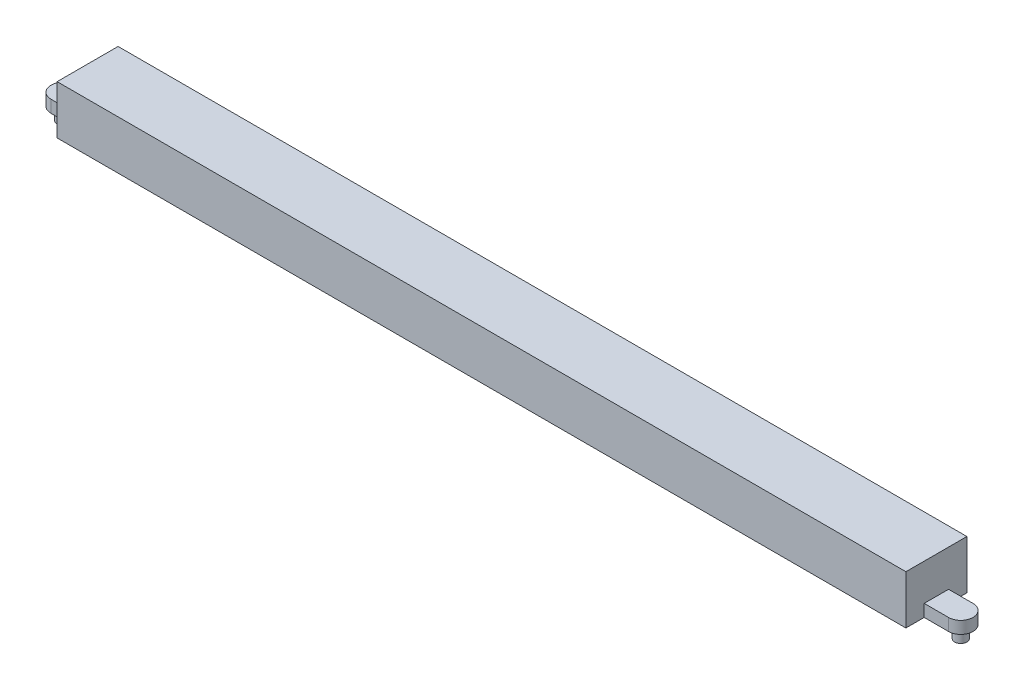
ISO-10303-21;
HEADER;
FILE_DESCRIPTION(('STEP AP214'),'2;1');
FILE_NAME('part.step','',(''),(''),'','','');
FILE_SCHEMA(('AUTOMOTIVE_DESIGN { 1 0 10303 214 1 1 1 1 }'));
ENDSEC;
DATA;
#1=APPLICATION_CONTEXT('core data for automotive mechanical design processes');
#2=APPLICATION_PROTOCOL_DEFINITION('international standard','automotive_design',2000,#1);
#3=PRODUCT_CONTEXT('',#1,'mechanical');
#4=PRODUCT('Part','Part','',(#3));
#5=PRODUCT_RELATED_PRODUCT_CATEGORY('part','',(#4));
#6=PRODUCT_DEFINITION_FORMATION('','',#4);
#7=PRODUCT_DEFINITION_CONTEXT('part definition',#1,'design');
#8=PRODUCT_DEFINITION('design','',#6,#7);
#9=PRODUCT_DEFINITION_SHAPE('','',#8);
#10=(LENGTH_UNIT() NAMED_UNIT(*) SI_UNIT(.MILLI.,.METRE.));
#11=(NAMED_UNIT(*) PLANE_ANGLE_UNIT() SI_UNIT($,.RADIAN.));
#12=(NAMED_UNIT(*) SI_UNIT($,.STERADIAN.) SOLID_ANGLE_UNIT());
#13=UNCERTAINTY_MEASURE_WITH_UNIT(LENGTH_MEASURE(1.E-05),#10,'distance_accuracy_value','');
#14=(GEOMETRIC_REPRESENTATION_CONTEXT(3) GLOBAL_UNCERTAINTY_ASSIGNED_CONTEXT((#13)) GLOBAL_UNIT_ASSIGNED_CONTEXT((#10,
#11,#12)) REPRESENTATION_CONTEXT('',''));
#15=CARTESIAN_POINT('',(0.,0.,0.));
#16=DIRECTION('',(0.,0.,1.));
#17=DIRECTION('',(1.,0.,0.));
#18=AXIS2_PLACEMENT_3D('',#15,#16,#17);
#19=CARTESIAN_POINT('',(0.,0.,0.));
#20=DIRECTION('',(0.,-1.,0.));
#21=DIRECTION('',(0.,0.,-1.));
#22=AXIS2_PLACEMENT_3D('',#19,#20,#21);
#23=PLANE('',#22);
#24=CARTESIAN_POINT('',(-36.8,0.,0.499999999999999));
#25=DIRECTION('',(0.,-1.,0.));
#26=DIRECTION('',(0.,0.,-1.));
#27=AXIS2_PLACEMENT_3D('',#24,#25,#26);
#28=CIRCLE('',#27,0.499999999999999);
#29=CARTESIAN_POINT('',(-36.8,0.,0.));
#30=VERTEX_POINT('',#29);
#31=EDGE_CURVE('E535',#30,#30,#28,.T.);
#32=ORIENTED_EDGE('',*,*,#31,.F.);
#33=EDGE_LOOP('',(#32));
#34=FACE_BOUND('',#33,.T.);
#35=DIRECTION('',(-1.,0.,0.));
#36=VECTOR('',#35,1.);
#37=CARTESIAN_POINT('',(-33.8,0.,-2.));
#38=LINE('',#37,#36);
#39=CARTESIAN_POINT('',(34.8,0.,-2.00000000000001));
#40=VERTEX_POINT('',#39);
#41=CARTESIAN_POINT('',(-34.8,0.,-2.));
#42=VERTEX_POINT('',#41);
#43=EDGE_CURVE('E297',#40,#42,#38,.T.);
#44=ORIENTED_EDGE('',*,*,#43,.F.);
#45=DIRECTION('',(0.,0.,-1.));
#46=VECTOR('',#45,1.);
#47=CARTESIAN_POINT('',(34.8,0.,3.00000000000001));
#48=LINE('',#47,#46);
#49=CARTESIAN_POINT('',(34.8,0.,-0.5));
#50=VERTEX_POINT('',#49);
#51=EDGE_CURVE('E243',#50,#40,#48,.T.);
#52=ORIENTED_EDGE('',*,*,#51,.F.);
#53=DIRECTION('',(-1.,0.,0.));
#54=VECTOR('',#53,1.);
#55=CARTESIAN_POINT('',(34.8,0.,-0.5));
#56=LINE('',#55,#54);
#57=CARTESIAN_POINT('',(36.8,0.,-0.499999999999999));
#58=VERTEX_POINT('',#57);
#59=EDGE_CURVE('E49',#58,#50,#56,.T.);
#60=ORIENTED_EDGE('',*,*,#59,.F.);
#61=CARTESIAN_POINT('',(36.8,0.,0.500000000000001));
#62=DIRECTION('',(0.,1.,0.));
#63=DIRECTION('',(0.,0.,1.));
#64=AXIS2_PLACEMENT_3D('',#61,#62,#63);
#65=CIRCLE('',#64,1.);
#66=CARTESIAN_POINT('',(36.8,0.,1.5));
#67=VERTEX_POINT('',#66);
#68=EDGE_CURVE('E193',#67,#58,#65,.T.);
#69=ORIENTED_EDGE('',*,*,#68,.F.);
#70=DIRECTION('',(1.,0.,0.));
#71=VECTOR('',#70,1.);
#72=CARTESIAN_POINT('',(34.8,0.,1.5));
#73=LINE('',#72,#71);
#74=CARTESIAN_POINT('',(34.8,0.,1.5));
#75=VERTEX_POINT('',#74);
#76=EDGE_CURVE('E189',#75,#67,#73,.T.);
#77=ORIENTED_EDGE('',*,*,#76,.F.);
#78=CARTESIAN_POINT('',(34.8,0.,3.00000000000001));
#79=VERTEX_POINT('',#78);
#80=EDGE_CURVE('E238',#79,#75,#48,.T.);
#81=ORIENTED_EDGE('',*,*,#80,.F.);
#82=DIRECTION('',(1.,0.,0.));
#83=VECTOR('',#82,1.);
#84=CARTESIAN_POINT('',(-34.8,0.,3.00000000000001));
#85=LINE('',#84,#83);
#86=CARTESIAN_POINT('',(-34.8,0.,3.00000000000001));
#87=VERTEX_POINT('',#86);
#88=EDGE_CURVE('E247',#87,#79,#85,.T.);
#89=ORIENTED_EDGE('',*,*,#88,.F.);
#90=DIRECTION('',(0.,0.,1.));
#91=VECTOR('',#90,1.);
#92=CARTESIAN_POINT('',(-34.8,0.,-2.));
#93=LINE('',#92,#91);
#94=CARTESIAN_POINT('',(-34.8,0.,1.5));
#95=VERTEX_POINT('',#94);
#96=EDGE_CURVE('E226',#95,#87,#93,.T.);
#97=ORIENTED_EDGE('',*,*,#96,.F.);
#98=DIRECTION('',(1.,0.,0.));
#99=VECTOR('',#98,1.);
#100=CARTESIAN_POINT('',(-36.8,0.,1.5));
#101=LINE('',#100,#99);
#102=CARTESIAN_POINT('',(-36.8,0.,1.5));
#103=VERTEX_POINT('',#102);
#104=EDGE_CURVE('E57',#103,#95,#101,.T.);
#105=ORIENTED_EDGE('',*,*,#104,.F.);
#106=CARTESIAN_POINT('',(-36.8,0.,0.499999999999999));
#107=DIRECTION('',(0.,1.,0.));
#108=DIRECTION('',(0.,0.,1.));
#109=AXIS2_PLACEMENT_3D('',#106,#107,#108);
#110=CIRCLE('',#109,1.);
#111=CARTESIAN_POINT('',(-36.8,0.,-0.500000000000001));
#112=VERTEX_POINT('',#111);
#113=EDGE_CURVE('E194',#112,#103,#110,.T.);
#114=ORIENTED_EDGE('',*,*,#113,.F.);
#115=DIRECTION('',(-1.,0.,0.));
#116=VECTOR('',#115,1.);
#117=CARTESIAN_POINT('',(-36.8,0.,-0.500000000000001));
#118=LINE('',#117,#116);
#119=CARTESIAN_POINT('',(-34.8,0.,-0.5));
#120=VERTEX_POINT('',#119);
#121=EDGE_CURVE('E208',#120,#112,#118,.T.);
#122=ORIENTED_EDGE('',*,*,#121,.F.);
#123=EDGE_CURVE('E329',#42,#120,#93,.T.);
#124=ORIENTED_EDGE('',*,*,#123,.F.);
#125=EDGE_LOOP('',(#44,#52,#60,#69,#77,#81,#89,#97,#105,#114,#122,#124));
#126=FACE_BOUND('',#125,.T.);
#127=CARTESIAN_POINT('',(36.8,0.,0.500000000000001));
#128=DIRECTION('',(0.,-1.,0.));
#129=DIRECTION('',(0.,0.,-1.));
#130=AXIS2_PLACEMENT_3D('',#127,#128,#129);
#131=CIRCLE('',#130,0.499999999999999);
#132=CARTESIAN_POINT('',(36.8,0.,0.));
#133=VERTEX_POINT('',#132);
#134=EDGE_CURVE('E536',#133,#133,#131,.T.);
#135=ORIENTED_EDGE('',*,*,#134,.F.);
#136=EDGE_LOOP('',(#135));
#137=FACE_BOUND('',#136,.T.);
#138=ADVANCED_FACE('F32',(#34,#126,#137),#23,.T.);
#139=CARTESIAN_POINT('',(34.8,3.,3.00000000000001));
#140=DIRECTION('',(-1.,0.,0.));
#141=DIRECTION('',(0.,0.,1.));
#142=AXIS2_PLACEMENT_3D('',#139,#140,#141);
#143=PLANE('',#142);
#144=DIRECTION('',(0.,-1.,0.));
#145=VECTOR('',#144,1.);
#146=CARTESIAN_POINT('',(34.8,1.,1.5));
#147=LINE('',#146,#145);
#148=CARTESIAN_POINT('',(34.8,1.,1.5));
#149=VERTEX_POINT('',#148);
#150=EDGE_CURVE('E198',#149,#75,#147,.T.);
#151=ORIENTED_EDGE('',*,*,#150,.F.);
#152=DIRECTION('',(0.,0.,1.));
#153=VECTOR('',#152,1.);
#154=CARTESIAN_POINT('',(34.8,1.,-0.5));
#155=LINE('',#154,#153);
#156=CARTESIAN_POINT('',(34.8,1.,-0.5));
#157=VERTEX_POINT('',#156);
#158=EDGE_CURVE('E179',#157,#149,#155,.T.);
#159=ORIENTED_EDGE('',*,*,#158,.F.);
#160=DIRECTION('',(0.,-1.,0.));
#161=VECTOR('',#160,1.);
#162=CARTESIAN_POINT('',(34.8,1.,-0.5));
#163=LINE('',#162,#161);
#164=EDGE_CURVE('E176',#157,#50,#163,.T.);
#165=ORIENTED_EDGE('',*,*,#164,.T.);
#166=ORIENTED_EDGE('',*,*,#51,.T.);
#167=DIRECTION('',(0.,-1.,0.));
#168=VECTOR('',#167,1.);
#169=CARTESIAN_POINT('',(34.8,3.,-2.00000000000001));
#170=LINE('',#169,#168);
#171=CARTESIAN_POINT('',(34.8,4.,-2.00000000000001));
#172=VERTEX_POINT('',#171);
#173=EDGE_CURVE('E257',#172,#40,#170,.T.);
#174=ORIENTED_EDGE('',*,*,#173,.F.);
#175=DIRECTION('',(0.,0.,-1.));
#176=VECTOR('',#175,1.);
#177=CARTESIAN_POINT('',(34.8,4.,3.00000000000001));
#178=LINE('',#177,#176);
#179=CARTESIAN_POINT('',(34.8,4.,3.00000000000001));
#180=VERTEX_POINT('',#179);
#181=EDGE_CURVE('E338',#180,#172,#178,.T.);
#182=ORIENTED_EDGE('',*,*,#181,.F.);
#183=DIRECTION('',(0.,-1.,0.));
#184=VECTOR('',#183,1.);
#185=CARTESIAN_POINT('',(34.8,3.,3.00000000000001));
#186=LINE('',#185,#184);
#187=EDGE_CURVE('E260',#180,#79,#186,.T.);
#188=ORIENTED_EDGE('',*,*,#187,.T.);
#189=ORIENTED_EDGE('',*,*,#80,.T.);
#190=EDGE_LOOP('',(#151,#159,#165,#166,#174,#182,#188,#189));
#191=FACE_BOUND('',#190,.T.);
#192=ADVANCED_FACE('F375',(#191),#143,.F.);
#193=CARTESIAN_POINT('',(-34.8,3.,-2.));
#194=DIRECTION('',(1.,0.,0.));
#195=DIRECTION('',(0.,0.,-1.));
#196=AXIS2_PLACEMENT_3D('',#193,#194,#195);
#197=PLANE('',#196);
#198=DIRECTION('',(0.,-1.,0.));
#199=VECTOR('',#198,1.);
#200=CARTESIAN_POINT('',(-34.8,1.,-0.5));
#201=LINE('',#200,#199);
#202=CARTESIAN_POINT('',(-34.8,1.,-0.5));
#203=VERTEX_POINT('',#202);
#204=EDGE_CURVE('E217',#203,#120,#201,.T.);
#205=ORIENTED_EDGE('',*,*,#204,.F.);
#206=DIRECTION('',(0.,0.,-1.));
#207=VECTOR('',#206,1.);
#208=CARTESIAN_POINT('',(-34.8,1.,-0.5));
#209=LINE('',#208,#207);
#210=CARTESIAN_POINT('',(-34.8,1.,1.5));
#211=VERTEX_POINT('',#210);
#212=EDGE_CURVE('E210',#211,#203,#209,.T.);
#213=ORIENTED_EDGE('',*,*,#212,.F.);
#214=DIRECTION('',(0.,-1.,0.));
#215=VECTOR('',#214,1.);
#216=CARTESIAN_POINT('',(-34.8,1.,1.5));
#217=LINE('',#216,#215);
#218=EDGE_CURVE('E223',#211,#95,#217,.T.);
#219=ORIENTED_EDGE('',*,*,#218,.T.);
#220=ORIENTED_EDGE('',*,*,#96,.T.);
#221=DIRECTION('',(0.,-1.,0.));
#222=VECTOR('',#221,1.);
#223=CARTESIAN_POINT('',(-34.8,3.,3.00000000000001));
#224=LINE('',#223,#222);
#225=CARTESIAN_POINT('',(-34.8,4.,3.00000000000001));
#226=VERTEX_POINT('',#225);
#227=EDGE_CURVE('E263',#226,#87,#224,.T.);
#228=ORIENTED_EDGE('',*,*,#227,.F.);
#229=DIRECTION('',(0.,0.,1.));
#230=VECTOR('',#229,1.);
#231=CARTESIAN_POINT('',(-34.8,4.,3.00000000000001));
#232=LINE('',#231,#230);
#233=CARTESIAN_POINT('',(-34.8,4.,-2.00000000000001));
#234=VERTEX_POINT('',#233);
#235=EDGE_CURVE('E350',#234,#226,#232,.T.);
#236=ORIENTED_EDGE('',*,*,#235,.F.);
#237=DIRECTION('',(0.,-1.,0.));
#238=VECTOR('',#237,1.);
#239=CARTESIAN_POINT('',(-34.8,3.,-2.));
#240=LINE('',#239,#238);
#241=EDGE_CURVE('E266',#234,#42,#240,.T.);
#242=ORIENTED_EDGE('',*,*,#241,.T.);
#243=ORIENTED_EDGE('',*,*,#123,.T.);
#244=EDGE_LOOP('',(#205,#213,#219,#220,#228,#236,#242,#243));
#245=FACE_BOUND('',#244,.T.);
#246=ADVANCED_FACE('F378',(#245),#197,.F.);
#247=CARTESIAN_POINT('',(-33.8,3.,2.));
#248=DIRECTION('',(-1.,0.,0.));
#249=DIRECTION('',(0.,0.,1.));
#250=AXIS2_PLACEMENT_3D('',#247,#248,#249);
#251=PLANE('',#250);
#252=DIRECTION('',(0.,-1.,0.));
#253=VECTOR('',#252,1.);
#254=CARTESIAN_POINT('',(-33.8,3.,2.));
#255=LINE('',#254,#253);
#256=CARTESIAN_POINT('',(-33.8,3.,2.));
#257=VERTEX_POINT('',#256);
#258=CARTESIAN_POINT('',(-33.8,1.,2.));
#259=VERTEX_POINT('',#258);
#260=EDGE_CURVE('E248',#257,#259,#255,.T.);
#261=ORIENTED_EDGE('',*,*,#260,.T.);
#262=DIRECTION('',(0.,0.,1.));
#263=VECTOR('',#262,1.);
#264=CARTESIAN_POINT('',(-33.8,1.,2.));
#265=LINE('',#264,#263);
#266=CARTESIAN_POINT('',(-33.8,1.,-2.));
#267=VERTEX_POINT('',#266);
#268=EDGE_CURVE('E303',#267,#259,#265,.T.);
#269=ORIENTED_EDGE('',*,*,#268,.F.);
#270=DIRECTION('',(0.,-1.,0.));
#271=VECTOR('',#270,1.);
#272=CARTESIAN_POINT('',(-33.8,3.,-2.));
#273=LINE('',#272,#271);
#274=CARTESIAN_POINT('',(-33.8,3.,-2.));
#275=VERTEX_POINT('',#274);
#276=EDGE_CURVE('E269',#275,#267,#273,.T.);
#277=ORIENTED_EDGE('',*,*,#276,.F.);
#278=DIRECTION('',(0.,0.,-1.));
#279=VECTOR('',#278,1.);
#280=CARTESIAN_POINT('',(-33.8,3.,2.));
#281=LINE('',#280,#279);
#282=EDGE_CURVE('E242',#257,#275,#281,.T.);
#283=ORIENTED_EDGE('',*,*,#282,.F.);
#284=EDGE_LOOP('',(#261,#269,#277,#283));
#285=FACE_BOUND('',#284,.T.);
#286=ADVANCED_FACE('F430',(#285),#251,.F.);
#287=CARTESIAN_POINT('',(33.8,3.,-2.));
#288=DIRECTION('',(1.,0.,0.));
#289=DIRECTION('',(0.,0.,-1.));
#290=AXIS2_PLACEMENT_3D('',#287,#288,#289);
#291=PLANE('',#290);
#292=DIRECTION('',(0.,-1.,0.));
#293=VECTOR('',#292,1.);
#294=CARTESIAN_POINT('',(33.8,3.,-2.));
#295=LINE('',#294,#293);
#296=CARTESIAN_POINT('',(33.8,3.,-2.));
#297=VERTEX_POINT('',#296);
#298=CARTESIAN_POINT('',(33.8,1.,-2.));
#299=VERTEX_POINT('',#298);
#300=EDGE_CURVE('E256',#297,#299,#295,.T.);
#301=ORIENTED_EDGE('',*,*,#300,.T.);
#302=DIRECTION('',(0.,0.,-1.));
#303=VECTOR('',#302,1.);
#304=CARTESIAN_POINT('',(33.8,1.,2.));
#305=LINE('',#304,#303);
#306=CARTESIAN_POINT('',(33.8,1.,2.));
#307=VERTEX_POINT('',#306);
#308=EDGE_CURVE('E298',#307,#299,#305,.T.);
#309=ORIENTED_EDGE('',*,*,#308,.F.);
#310=DIRECTION('',(0.,-1.,0.));
#311=VECTOR('',#310,1.);
#312=CARTESIAN_POINT('',(33.8,3.,2.));
#313=LINE('',#312,#311);
#314=CARTESIAN_POINT('',(33.8,3.,2.));
#315=VERTEX_POINT('',#314);
#316=EDGE_CURVE('E252',#315,#307,#313,.T.);
#317=ORIENTED_EDGE('',*,*,#316,.F.);
#318=DIRECTION('',(0.,0.,1.));
#319=VECTOR('',#318,1.);
#320=CARTESIAN_POINT('',(33.8,3.,-2.));
#321=LINE('',#320,#319);
#322=EDGE_CURVE('E312',#297,#315,#321,.T.);
#323=ORIENTED_EDGE('',*,*,#322,.F.);
#324=EDGE_LOOP('',(#301,#309,#317,#323));
#325=FACE_BOUND('',#324,.T.);
#326=ADVANCED_FACE('F433',(#325),#291,.F.);
#327=CARTESIAN_POINT('',(33.8,3.,2.));
#328=DIRECTION('',(0.,0.,1.));
#329=DIRECTION('',(1.,0.,0.));
#330=AXIS2_PLACEMENT_3D('',#327,#328,#329);
#331=PLANE('',#330);
#332=ORIENTED_EDGE('',*,*,#316,.T.);
#333=DIRECTION('',(1.,0.,0.));
#334=VECTOR('',#333,1.);
#335=CARTESIAN_POINT('',(-33.8,1.,2.));
#336=LINE('',#335,#334);
#337=CARTESIAN_POINT('',(-17.3,1.,2.));
#338=VERTEX_POINT('',#337);
#339=EDGE_CURVE('E305',#338,#307,#336,.T.);
#340=ORIENTED_EDGE('',*,*,#339,.F.);
#341=DIRECTION('',(0.,1.,0.));
#342=VECTOR('',#341,1.);
#343=CARTESIAN_POINT('',(-17.3,2.,2.));
#344=LINE('',#343,#342);
#345=CARTESIAN_POINT('',(-17.3,2.,2.));
#346=VERTEX_POINT('',#345);
#347=EDGE_CURVE('E273',#338,#346,#344,.T.);
#348=ORIENTED_EDGE('',*,*,#347,.T.);
#349=DIRECTION('',(-1.,0.,0.));
#350=VECTOR('',#349,1.);
#351=CARTESIAN_POINT('',(-17.7,2.,2.));
#352=LINE('',#351,#350);
#353=CARTESIAN_POINT('',(-18.1,2.,2.));
#354=VERTEX_POINT('',#353);
#355=EDGE_CURVE('E276',#346,#354,#352,.T.);
#356=ORIENTED_EDGE('',*,*,#355,.T.);
#357=DIRECTION('',(0.,-1.,0.));
#358=VECTOR('',#357,1.);
#359=CARTESIAN_POINT('',(-18.1,2.,2.));
#360=LINE('',#359,#358);
#361=CARTESIAN_POINT('',(-18.1,1.,2.));
#362=VERTEX_POINT('',#361);
#363=EDGE_CURVE('E270',#354,#362,#360,.T.);
#364=ORIENTED_EDGE('',*,*,#363,.T.);
#365=EDGE_CURVE('E41',#259,#362,#336,.T.);
#366=ORIENTED_EDGE('',*,*,#365,.F.);
#367=ORIENTED_EDGE('',*,*,#260,.F.);
#368=DIRECTION('',(-1.,0.,0.));
#369=VECTOR('',#368,1.);
#370=CARTESIAN_POINT('',(33.8,3.,2.));
#371=LINE('',#370,#369);
#372=EDGE_CURVE('E253',#315,#257,#371,.T.);
#373=ORIENTED_EDGE('',*,*,#372,.F.);
#374=EDGE_LOOP('',(#332,#340,#348,#356,#364,#366,#367,#373));
#375=FACE_BOUND('',#374,.T.);
#376=ADVANCED_FACE('F438',(#375),#331,.F.);
#377=CARTESIAN_POINT('',(-34.8,3.,3.00000000000001));
#378=DIRECTION('',(0.,0.,-1.));
#379=DIRECTION('',(-1.,0.,0.));
#380=AXIS2_PLACEMENT_3D('',#377,#378,#379);
#381=PLANE('',#380);
#382=ORIENTED_EDGE('',*,*,#88,.T.);
#383=ORIENTED_EDGE('',*,*,#187,.F.);
#384=DIRECTION('',(1.,0.,0.));
#385=VECTOR('',#384,1.);
#386=CARTESIAN_POINT('',(-34.8,4.,3.00000000000001));
#387=LINE('',#386,#385);
#388=EDGE_CURVE('E345',#226,#180,#387,.T.);
#389=ORIENTED_EDGE('',*,*,#388,.F.);
#390=ORIENTED_EDGE('',*,*,#227,.T.);
#391=EDGE_LOOP('',(#382,#383,#389,#390));
#392=FACE_BOUND('',#391,.T.);
#393=ADVANCED_FACE('F370',(#392),#381,.F.);
#394=CARTESIAN_POINT('',(-17.3,2.,2.5));
#395=DIRECTION('',(-1.,0.,0.));
#396=DIRECTION('',(0.,0.,1.));
#397=AXIS2_PLACEMENT_3D('',#394,#395,#396);
#398=PLANE('',#397);
#399=ORIENTED_EDGE('',*,*,#347,.F.);
#400=DIRECTION('',(0.,0.,-1.));
#401=VECTOR('',#400,1.);
#402=CARTESIAN_POINT('',(-17.3,1.,2.5));
#403=LINE('',#402,#401);
#404=CARTESIAN_POINT('',(-17.3,1.,-1.));
#405=VERTEX_POINT('',#404);
#406=EDGE_CURVE('E11',#338,#405,#403,.T.);
#407=ORIENTED_EDGE('',*,*,#406,.T.);
#408=DIRECTION('',(0.,-1.,0.));
#409=VECTOR('',#408,1.);
#410=CARTESIAN_POINT('',(-17.3,2.,-1.));
#411=LINE('',#410,#409);
#412=CARTESIAN_POINT('',(-17.3,2.,-1.));
#413=VERTEX_POINT('',#412);
#414=EDGE_CURVE('E294',#413,#405,#411,.T.);
#415=ORIENTED_EDGE('',*,*,#414,.F.);
#416=DIRECTION('',(0.,0.,-1.));
#417=VECTOR('',#416,1.);
#418=CARTESIAN_POINT('',(-17.3,2.,2.5));
#419=LINE('',#418,#417);
#420=EDGE_CURVE('E280',#346,#413,#419,.T.);
#421=ORIENTED_EDGE('',*,*,#420,.F.);
#422=EDGE_LOOP('',(#399,#407,#415,#421));
#423=FACE_BOUND('',#422,.T.);
#424=ADVANCED_FACE('F415',(#423),#398,.F.);
#425=CARTESIAN_POINT('',(-18.1,2.,2.5));
#426=DIRECTION('',(1.,0.,0.));
#427=DIRECTION('',(0.,0.,-1.));
#428=AXIS2_PLACEMENT_3D('',#425,#426,#427);
#429=PLANE('',#428);
#430=ORIENTED_EDGE('',*,*,#363,.F.);
#431=DIRECTION('',(0.,0.,1.));
#432=VECTOR('',#431,1.);
#433=CARTESIAN_POINT('',(-18.1,2.,2.5));
#434=LINE('',#433,#432);
#435=CARTESIAN_POINT('',(-18.1,2.,-1.));
#436=VERTEX_POINT('',#435);
#437=EDGE_CURVE('E285',#436,#354,#434,.T.);
#438=ORIENTED_EDGE('',*,*,#437,.F.);
#439=DIRECTION('',(0.,-1.,0.));
#440=VECTOR('',#439,1.);
#441=CARTESIAN_POINT('',(-18.1,2.,-1.));
#442=LINE('',#441,#440);
#443=CARTESIAN_POINT('',(-18.1,1.,-1.));
#444=VERTEX_POINT('',#443);
#445=EDGE_CURVE('E286',#436,#444,#442,.T.);
#446=ORIENTED_EDGE('',*,*,#445,.T.);
#447=DIRECTION('',(0.,0.,1.));
#448=VECTOR('',#447,1.);
#449=CARTESIAN_POINT('',(-18.1,1.,2.5));
#450=LINE('',#449,#448);
#451=EDGE_CURVE('E283',#444,#362,#450,.T.);
#452=ORIENTED_EDGE('',*,*,#451,.T.);
#453=EDGE_LOOP('',(#430,#438,#446,#452));
#454=FACE_BOUND('',#453,.T.);
#455=ADVANCED_FACE('F418',(#454),#429,.F.);
#456=CARTESIAN_POINT('',(-17.7,2.,-1.));
#457=DIRECTION('',(0.,-1.,0.));
#458=DIRECTION('',(0.,0.,-1.));
#459=AXIS2_PLACEMENT_3D('',#456,#457,#458);
#460=PLANE('',#459);
#461=ORIENTED_EDGE('',*,*,#355,.F.);
#462=ORIENTED_EDGE('',*,*,#420,.T.);
#463=CARTESIAN_POINT('',(-17.7,2.,-1.));
#464=DIRECTION('',(0.,1.,0.));
#465=DIRECTION('',(0.,0.,-1.));
#466=AXIS2_PLACEMENT_3D('',#463,#464,#465);
#467=CIRCLE('',#466,0.399999999999999);
#468=EDGE_CURVE('E282',#413,#436,#467,.T.);
#469=ORIENTED_EDGE('',*,*,#468,.T.);
#470=ORIENTED_EDGE('',*,*,#437,.T.);
#471=EDGE_LOOP('',(#461,#462,#469,#470));
#472=FACE_BOUND('',#471,.T.);
#473=ADVANCED_FACE('F413',(#472),#460,.F.);
#474=CARTESIAN_POINT('',(0.,1.,0.));
#475=DIRECTION('',(0.,-1.,0.));
#476=DIRECTION('',(0.,0.,-1.));
#477=AXIS2_PLACEMENT_3D('',#474,#475,#476);
#478=PLANE('',#477);
#479=ORIENTED_EDGE('',*,*,#451,.F.);
#480=CARTESIAN_POINT('',(-17.7,1.,-1.));
#481=DIRECTION('',(0.,1.,0.));
#482=DIRECTION('',(0.,0.,-1.));
#483=AXIS2_PLACEMENT_3D('',#480,#481,#482);
#484=CIRCLE('',#483,0.399999999999999);
#485=EDGE_CURVE('E279',#405,#444,#484,.T.);
#486=ORIENTED_EDGE('',*,*,#485,.F.);
#487=ORIENTED_EDGE('',*,*,#406,.F.);
#488=ORIENTED_EDGE('',*,*,#339,.T.);
#489=ORIENTED_EDGE('',*,*,#308,.T.);
#490=DIRECTION('',(-1.,0.,0.));
#491=VECTOR('',#490,1.);
#492=CARTESIAN_POINT('',(-33.8,1.,-2.));
#493=LINE('',#492,#491);
#494=EDGE_CURVE('E301',#299,#267,#493,.T.);
#495=ORIENTED_EDGE('',*,*,#494,.T.);
#496=ORIENTED_EDGE('',*,*,#268,.T.);
#497=ORIENTED_EDGE('',*,*,#365,.T.);
#498=EDGE_LOOP('',(#479,#486,#487,#488,#489,#495,#496,#497));
#499=FACE_BOUND('',#498,.T.);
#500=ADVANCED_FACE('F410',(#499),#478,.F.);
#501=CARTESIAN_POINT('',(-33.8,1.,-2.));
#502=DIRECTION('',(0.,0.,1.));
#503=DIRECTION('',(1.,0.,0.));
#504=AXIS2_PLACEMENT_3D('',#501,#502,#503);
#505=PLANE('',#504);
#506=ORIENTED_EDGE('',*,*,#241,.F.);
#507=DIRECTION('',(-1.,0.,0.));
#508=VECTOR('',#507,1.);
#509=CARTESIAN_POINT('',(-34.8,4.,-2.00000000000001));
#510=LINE('',#509,#508);
#511=EDGE_CURVE('E335',#172,#234,#510,.T.);
#512=ORIENTED_EDGE('',*,*,#511,.F.);
#513=ORIENTED_EDGE('',*,*,#173,.T.);
#514=ORIENTED_EDGE('',*,*,#43,.T.);
#515=EDGE_LOOP('',(#506,#512,#513,#514));
#516=FACE_BOUND('',#515,.T.);
#517=DIRECTION('',(-1.,0.,0.));
#518=VECTOR('',#517,1.);
#519=CARTESIAN_POINT('',(-34.8,3.,-2.00000000000001));
#520=LINE('',#519,#518);
#521=EDGE_CURVE('E324',#297,#275,#520,.T.);
#522=ORIENTED_EDGE('',*,*,#521,.T.);
#523=ORIENTED_EDGE('',*,*,#276,.T.);
#524=ORIENTED_EDGE('',*,*,#494,.F.);
#525=ORIENTED_EDGE('',*,*,#300,.F.);
#526=EDGE_LOOP('',(#522,#523,#524,#525));
#527=FACE_BOUND('',#526,.T.);
#528=ADVANCED_FACE('F34',(#516,#527),#505,.F.);
#529=CARTESIAN_POINT('',(-17.7,2.,-1.));
#530=DIRECTION('',(0.,-1.,0.));
#531=DIRECTION('',(0.,0.,-1.));
#532=AXIS2_PLACEMENT_3D('',#529,#530,#531);
#533=CYLINDRICAL_SURFACE('',#532,0.399999999999999);
#534=ORIENTED_EDGE('',*,*,#485,.T.);
#535=ORIENTED_EDGE('',*,*,#445,.F.);
#536=ORIENTED_EDGE('',*,*,#468,.F.);
#537=ORIENTED_EDGE('',*,*,#414,.T.);
#538=EDGE_LOOP('',(#534,#535,#536,#537));
#539=FACE_BOUND('',#538,.T.);
#540=ADVANCED_FACE('F420',(#539),#533,.T.);
#541=CARTESIAN_POINT('',(0.,4.,0.));
#542=DIRECTION('',(0.,-1.,0.));
#543=DIRECTION('',(0.,0.,-1.));
#544=AXIS2_PLACEMENT_3D('',#541,#542,#543);
#545=PLANE('',#544);
#546=ORIENTED_EDGE('',*,*,#235,.T.);
#547=ORIENTED_EDGE('',*,*,#388,.T.);
#548=ORIENTED_EDGE('',*,*,#181,.T.);
#549=ORIENTED_EDGE('',*,*,#511,.T.);
#550=EDGE_LOOP('',(#546,#547,#548,#549));
#551=FACE_BOUND('',#550,.T.);
#552=ADVANCED_FACE('F376',(#551),#545,.F.);
#553=CARTESIAN_POINT('',(0.,3.,0.));
#554=DIRECTION('',(0.,-1.,0.));
#555=DIRECTION('',(0.,0.,-1.));
#556=AXIS2_PLACEMENT_3D('',#553,#554,#555);
#557=PLANE('',#556);
#558=ORIENTED_EDGE('',*,*,#372,.T.);
#559=ORIENTED_EDGE('',*,*,#282,.T.);
#560=ORIENTED_EDGE('',*,*,#521,.F.);
#561=ORIENTED_EDGE('',*,*,#322,.T.);
#562=EDGE_LOOP('',(#558,#559,#560,#561));
#563=FACE_BOUND('',#562,.T.);
#564=ADVANCED_FACE('F446',(#563),#557,.T.);
#565=CARTESIAN_POINT('',(-36.8,1.,0.499999999999999));
#566=DIRECTION('',(0.,-1.,0.));
#567=DIRECTION('',(0.,0.,-1.));
#568=AXIS2_PLACEMENT_3D('',#565,#566,#567);
#569=CYLINDRICAL_SURFACE('',#568,1.);
#570=ORIENTED_EDGE('',*,*,#113,.T.);
#571=DIRECTION('',(0.,-1.,0.));
#572=VECTOR('',#571,1.);
#573=CARTESIAN_POINT('',(-36.8,1.,1.5));
#574=LINE('',#573,#572);
#575=CARTESIAN_POINT('',(-36.8,1.,1.5));
#576=VERTEX_POINT('',#575);
#577=EDGE_CURVE('E220',#576,#103,#574,.T.);
#578=ORIENTED_EDGE('',*,*,#577,.F.);
#579=CARTESIAN_POINT('',(-36.8,1.,0.499999999999999));
#580=DIRECTION('',(0.,1.,0.));
#581=DIRECTION('',(0.,0.,1.));
#582=AXIS2_PLACEMENT_3D('',#579,#580,#581);
#583=CIRCLE('',#582,1.);
#584=CARTESIAN_POINT('',(-36.8,1.,-0.500000000000001));
#585=VERTEX_POINT('',#584);
#586=EDGE_CURVE('E204',#585,#576,#583,.T.);
#587=ORIENTED_EDGE('',*,*,#586,.F.);
#588=DIRECTION('',(0.,-1.,0.));
#589=VECTOR('',#588,1.);
#590=CARTESIAN_POINT('',(-36.8,1.,-0.500000000000001));
#591=LINE('',#590,#589);
#592=EDGE_CURVE('E213',#585,#112,#591,.T.);
#593=ORIENTED_EDGE('',*,*,#592,.T.);
#594=EDGE_LOOP('',(#570,#578,#587,#593));
#595=FACE_BOUND('',#594,.T.);
#596=ADVANCED_FACE('F360',(#595),#569,.T.);
#597=CARTESIAN_POINT('',(-36.8,1.,1.5));
#598=DIRECTION('',(0.,0.,-1.));
#599=DIRECTION('',(-1.,0.,0.));
#600=AXIS2_PLACEMENT_3D('',#597,#598,#599);
#601=PLANE('',#600);
#602=ORIENTED_EDGE('',*,*,#104,.T.);
#603=ORIENTED_EDGE('',*,*,#218,.F.);
#604=DIRECTION('',(1.,0.,0.));
#605=VECTOR('',#604,1.);
#606=CARTESIAN_POINT('',(-36.8,1.,1.5));
#607=LINE('',#606,#605);
#608=EDGE_CURVE('E207',#576,#211,#607,.T.);
#609=ORIENTED_EDGE('',*,*,#608,.F.);
#610=ORIENTED_EDGE('',*,*,#577,.T.);
#611=EDGE_LOOP('',(#602,#603,#609,#610));
#612=FACE_BOUND('',#611,.T.);
#613=ADVANCED_FACE('F356',(#612),#601,.F.);
#614=CARTESIAN_POINT('',(-36.8,1.,-0.500000000000001));
#615=DIRECTION('',(0.,0.,1.));
#616=DIRECTION('',(1.,0.,0.));
#617=AXIS2_PLACEMENT_3D('',#614,#615,#616);
#618=PLANE('',#617);
#619=ORIENTED_EDGE('',*,*,#121,.T.);
#620=ORIENTED_EDGE('',*,*,#592,.F.);
#621=DIRECTION('',(-1.,0.,0.));
#622=VECTOR('',#621,1.);
#623=CARTESIAN_POINT('',(-36.8,1.,-0.500000000000001));
#624=LINE('',#623,#622);
#625=EDGE_CURVE('E212',#203,#585,#624,.T.);
#626=ORIENTED_EDGE('',*,*,#625,.F.);
#627=ORIENTED_EDGE('',*,*,#204,.T.);
#628=EDGE_LOOP('',(#619,#620,#626,#627));
#629=FACE_BOUND('',#628,.T.);
#630=ADVANCED_FACE('F456',(#629),#618,.F.);
#631=CARTESIAN_POINT('',(-36.8,1.,0.499999999999999));
#632=DIRECTION('',(0.,1.,0.));
#633=DIRECTION('',(0.,0.,1.));
#634=AXIS2_PLACEMENT_3D('',#631,#632,#633);
#635=PLANE('',#634);
#636=ORIENTED_EDGE('',*,*,#586,.T.);
#637=ORIENTED_EDGE('',*,*,#608,.T.);
#638=ORIENTED_EDGE('',*,*,#212,.T.);
#639=ORIENTED_EDGE('',*,*,#625,.T.);
#640=EDGE_LOOP('',(#636,#637,#638,#639));
#641=FACE_BOUND('',#640,.T.);
#642=ADVANCED_FACE('F459',(#641),#635,.T.);
#643=CARTESIAN_POINT('',(36.8,1.,0.500000000000001));
#644=DIRECTION('',(0.,-1.,0.));
#645=DIRECTION('',(0.,0.,-1.));
#646=AXIS2_PLACEMENT_3D('',#643,#644,#645);
#647=CYLINDRICAL_SURFACE('',#646,1.);
#648=ORIENTED_EDGE('',*,*,#68,.T.);
#649=DIRECTION('',(0.,-1.,0.));
#650=VECTOR('',#649,1.);
#651=CARTESIAN_POINT('',(36.8,1.,-0.499999999999999));
#652=LINE('',#651,#650);
#653=CARTESIAN_POINT('',(36.8,1.,-0.499999999999999));
#654=VERTEX_POINT('',#653);
#655=EDGE_CURVE('E174',#654,#58,#652,.T.);
#656=ORIENTED_EDGE('',*,*,#655,.F.);
#657=CARTESIAN_POINT('',(36.8,1.,0.500000000000001));
#658=DIRECTION('',(0.,1.,0.));
#659=DIRECTION('',(0.,0.,1.));
#660=AXIS2_PLACEMENT_3D('',#657,#658,#659);
#661=CIRCLE('',#660,1.);
#662=CARTESIAN_POINT('',(36.8,1.,1.5));
#663=VERTEX_POINT('',#662);
#664=EDGE_CURVE('E180',#663,#654,#661,.T.);
#665=ORIENTED_EDGE('',*,*,#664,.F.);
#666=DIRECTION('',(0.,-1.,0.));
#667=VECTOR('',#666,1.);
#668=CARTESIAN_POINT('',(36.8,1.,1.5));
#669=LINE('',#668,#667);
#670=EDGE_CURVE('E381',#663,#67,#669,.T.);
#671=ORIENTED_EDGE('',*,*,#670,.T.);
#672=EDGE_LOOP('',(#648,#656,#665,#671));
#673=FACE_BOUND('',#672,.T.);
#674=ADVANCED_FACE('F191',(#673),#647,.T.);
#675=CARTESIAN_POINT('',(34.8,1.,-0.5));
#676=DIRECTION('',(0.,0.,1.));
#677=DIRECTION('',(1.,0.,0.));
#678=AXIS2_PLACEMENT_3D('',#675,#676,#677);
#679=PLANE('',#678);
#680=ORIENTED_EDGE('',*,*,#59,.T.);
#681=ORIENTED_EDGE('',*,*,#164,.F.);
#682=DIRECTION('',(-1.,0.,0.));
#683=VECTOR('',#682,1.);
#684=CARTESIAN_POINT('',(34.8,1.,-0.5));
#685=LINE('',#684,#683);
#686=EDGE_CURVE('E170',#654,#157,#685,.T.);
#687=ORIENTED_EDGE('',*,*,#686,.F.);
#688=ORIENTED_EDGE('',*,*,#655,.T.);
#689=EDGE_LOOP('',(#680,#681,#687,#688));
#690=FACE_BOUND('',#689,.T.);
#691=ADVANCED_FACE('F172',(#690),#679,.F.);
#692=CARTESIAN_POINT('',(34.8,1.,1.5));
#693=DIRECTION('',(0.,0.,-1.));
#694=DIRECTION('',(-1.,0.,0.));
#695=AXIS2_PLACEMENT_3D('',#692,#693,#694);
#696=PLANE('',#695);
#697=ORIENTED_EDGE('',*,*,#76,.T.);
#698=ORIENTED_EDGE('',*,*,#670,.F.);
#699=DIRECTION('',(1.,0.,0.));
#700=VECTOR('',#699,1.);
#701=CARTESIAN_POINT('',(34.8,1.,1.5));
#702=LINE('',#701,#700);
#703=EDGE_CURVE('E185',#149,#663,#702,.T.);
#704=ORIENTED_EDGE('',*,*,#703,.F.);
#705=ORIENTED_EDGE('',*,*,#150,.T.);
#706=EDGE_LOOP('',(#697,#698,#704,#705));
#707=FACE_BOUND('',#706,.T.);
#708=ADVANCED_FACE('F392',(#707),#696,.F.);
#709=CARTESIAN_POINT('',(36.8,1.,0.500000000000001));
#710=DIRECTION('',(0.,1.,0.));
#711=DIRECTION('',(0.,0.,1.));
#712=AXIS2_PLACEMENT_3D('',#709,#710,#711);
#713=PLANE('',#712);
#714=ORIENTED_EDGE('',*,*,#664,.T.);
#715=ORIENTED_EDGE('',*,*,#686,.T.);
#716=ORIENTED_EDGE('',*,*,#158,.T.);
#717=ORIENTED_EDGE('',*,*,#703,.T.);
#718=EDGE_LOOP('',(#714,#715,#716,#717));
#719=FACE_BOUND('',#718,.T.);
#720=ADVANCED_FACE('F183',(#719),#713,.T.);
#721=CARTESIAN_POINT('',(-36.8,-1.,0.499999999999999));
#722=DIRECTION('',(0.,1.,0.));
#723=DIRECTION('',(0.,0.,1.));
#724=AXIS2_PLACEMENT_3D('',#721,#722,#723);
#725=CYLINDRICAL_SURFACE('',#724,0.499999999999999);
#726=CARTESIAN_POINT('',(-36.8,-1.,0.499999999999999));
#727=DIRECTION('',(0.,-1.,0.));
#728=DIRECTION('',(0.,0.,-1.));
#729=AXIS2_PLACEMENT_3D('',#726,#727,#728);
#730=CIRCLE('',#729,0.499999999999999);
#731=CARTESIAN_POINT('',(-36.8,-1.,0.));
#732=VERTEX_POINT('',#731);
#733=EDGE_CURVE('E384',#732,#732,#730,.T.);
#734=ORIENTED_EDGE('',*,*,#733,.F.);
#735=EDGE_LOOP('',(#734));
#736=FACE_BOUND('',#735,.T.);
#737=ORIENTED_EDGE('',*,*,#31,.T.);
#738=EDGE_LOOP('',(#737));
#739=FACE_BOUND('',#738,.T.);
#740=ADVANCED_FACE('F399',(#736,#739),#725,.T.);
#741=CARTESIAN_POINT('',(-36.8,-1.,0.499999999999999));
#742=DIRECTION('',(0.,-1.,0.));
#743=DIRECTION('',(0.,0.,-1.));
#744=AXIS2_PLACEMENT_3D('',#741,#742,#743);
#745=PLANE('',#744);
#746=ORIENTED_EDGE('',*,*,#733,.T.);
#747=EDGE_LOOP('',(#746));
#748=FACE_BOUND('',#747,.T.);
#749=ADVANCED_FACE('F498',(#748),#745,.T.);
#750=CARTESIAN_POINT('',(36.8,-1.,0.500000000000001));
#751=DIRECTION('',(0.,1.,0.));
#752=DIRECTION('',(0.,0.,1.));
#753=AXIS2_PLACEMENT_3D('',#750,#751,#752);
#754=CYLINDRICAL_SURFACE('',#753,0.499999999999999);
#755=CARTESIAN_POINT('',(36.8,-1.,0.500000000000001));
#756=DIRECTION('',(0.,-1.,0.));
#757=DIRECTION('',(0.,0.,-1.));
#758=AXIS2_PLACEMENT_3D('',#755,#756,#757);
#759=CIRCLE('',#758,0.499999999999999);
#760=CARTESIAN_POINT('',(36.8,-1.,0.));
#761=VERTEX_POINT('',#760);
#762=EDGE_CURVE('E534',#761,#761,#759,.T.);
#763=ORIENTED_EDGE('',*,*,#762,.F.);
#764=EDGE_LOOP('',(#763));
#765=FACE_BOUND('',#764,.T.);
#766=ORIENTED_EDGE('',*,*,#134,.T.);
#767=EDGE_LOOP('',(#766));
#768=FACE_BOUND('',#767,.T.);
#769=ADVANCED_FACE('F508',(#765,#768),#754,.T.);
#770=CARTESIAN_POINT('',(36.8,-1.,0.500000000000001));
#771=DIRECTION('',(0.,-1.,0.));
#772=DIRECTION('',(0.,0.,-1.));
#773=AXIS2_PLACEMENT_3D('',#770,#771,#772);
#774=PLANE('',#773);
#775=ORIENTED_EDGE('',*,*,#762,.T.);
#776=EDGE_LOOP('',(#775));
#777=FACE_BOUND('',#776,.T.);
#778=ADVANCED_FACE('F518',(#777),#774,.T.);
#779=CLOSED_SHELL('',(#138,#192,#246,#286,#326,#376,#393,#424,#455,#473,#500,#528,#540,#552,
#564,#596,#613,#630,#642,#674,#691,#708,#720,#740,#749,#769,#778));
#780=MANIFOLD_SOLID_BREP('B2',#779);
#781=ADVANCED_BREP_SHAPE_REPRESENTATION('',(#18,#780),#14);
#782=SHAPE_DEFINITION_REPRESENTATION(#9,#781);
ENDSEC;
END-ISO-10303-21;
